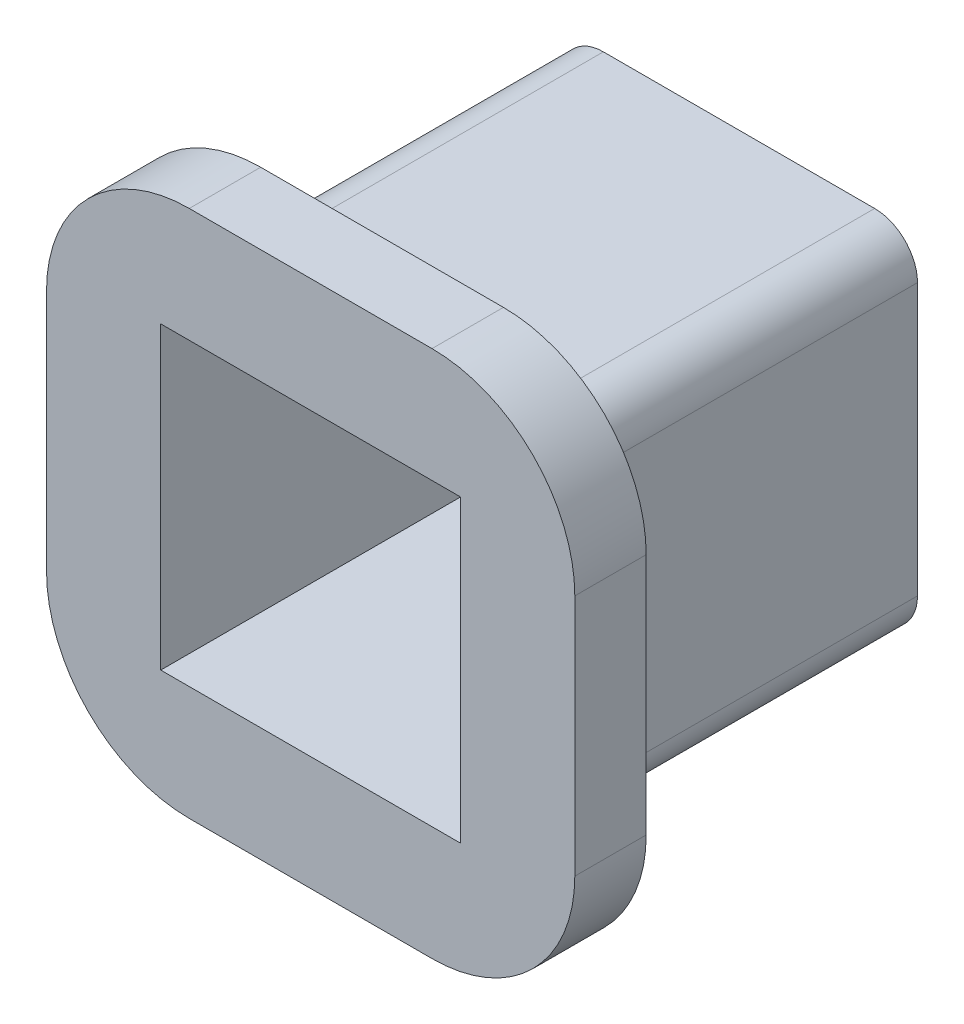
ISO-10303-21;
HEADER;
FILE_DESCRIPTION(('STEP AP214'),'2;1');
FILE_NAME('part.step','',(''),(''),'','','');
FILE_SCHEMA(('AUTOMOTIVE_DESIGN { 1 0 10303 214 1 1 1 1 }'));
ENDSEC;
DATA;
#1=APPLICATION_CONTEXT('core data for automotive mechanical design processes');
#2=APPLICATION_PROTOCOL_DEFINITION('international standard','automotive_design',2000,#1);
#3=PRODUCT_CONTEXT('',#1,'mechanical');
#4=PRODUCT('Part','Part','',(#3));
#5=PRODUCT_RELATED_PRODUCT_CATEGORY('part','',(#4));
#6=PRODUCT_DEFINITION_FORMATION('','',#4);
#7=PRODUCT_DEFINITION_CONTEXT('part definition',#1,'design');
#8=PRODUCT_DEFINITION('design','',#6,#7);
#9=PRODUCT_DEFINITION_SHAPE('','',#8);
#10=(LENGTH_UNIT() NAMED_UNIT(*) SI_UNIT(.MILLI.,.METRE.));
#11=(NAMED_UNIT(*) PLANE_ANGLE_UNIT() SI_UNIT($,.RADIAN.));
#12=(NAMED_UNIT(*) SI_UNIT($,.STERADIAN.) SOLID_ANGLE_UNIT());
#13=UNCERTAINTY_MEASURE_WITH_UNIT(LENGTH_MEASURE(1.E-05),#10,'distance_accuracy_value','');
#14=(GEOMETRIC_REPRESENTATION_CONTEXT(3) GLOBAL_UNCERTAINTY_ASSIGNED_CONTEXT((#13)) GLOBAL_UNIT_ASSIGNED_CONTEXT((#10,
#11,#12)) REPRESENTATION_CONTEXT('',''));
#15=CARTESIAN_POINT('',(0.,0.,0.));
#16=DIRECTION('',(0.,0.,1.));
#17=DIRECTION('',(1.,0.,0.));
#18=AXIS2_PLACEMENT_3D('',#15,#16,#17);
#19=CARTESIAN_POINT('',(12.5,12.5,30.));
#20=DIRECTION('',(-1.,0.,0.));
#21=DIRECTION('',(0.,-1.,0.));
#22=AXIS2_PLACEMENT_3D('',#19,#20,#21);
#23=PLANE('',#22);
#24=DIRECTION('',(0.,1.,0.));
#25=VECTOR('',#24,1.);
#26=CARTESIAN_POINT('',(12.5,-12.5,25.));
#27=LINE('',#26,#25);
#28=CARTESIAN_POINT('',(12.5,-9.5,25.));
#29=VERTEX_POINT('',#28);
#30=CARTESIAN_POINT('',(12.5,9.5,25.));
#31=VERTEX_POINT('',#30);
#32=EDGE_CURVE('E351',#29,#31,#27,.T.);
#33=ORIENTED_EDGE('',*,*,#32,.F.);
#34=DIRECTION('',(0.,0.,-1.));
#35=VECTOR('',#34,1.);
#36=CARTESIAN_POINT('',(12.5,-9.5,30.));
#37=LINE('',#36,#35);
#38=CARTESIAN_POINT('',(12.5,-9.5,0.));
#39=VERTEX_POINT('',#38);
#40=EDGE_CURVE('E330',#29,#39,#37,.T.);
#41=ORIENTED_EDGE('',*,*,#40,.T.);
#42=DIRECTION('',(0.,1.,0.));
#43=VECTOR('',#42,1.);
#44=CARTESIAN_POINT('',(12.5,12.5,0.));
#45=LINE('',#44,#43);
#46=CARTESIAN_POINT('',(12.5,9.5,0.));
#47=VERTEX_POINT('',#46);
#48=EDGE_CURVE('E198',#39,#47,#45,.T.);
#49=ORIENTED_EDGE('',*,*,#48,.T.);
#50=DIRECTION('',(0.,0.,-1.));
#51=VECTOR('',#50,1.);
#52=CARTESIAN_POINT('',(12.5,9.5,30.));
#53=LINE('',#52,#51);
#54=EDGE_CURVE('E327',#47,#31,#53,.F.);
#55=ORIENTED_EDGE('',*,*,#54,.T.);
#56=EDGE_LOOP('',(#33,#41,#49,#55));
#57=FACE_BOUND('',#56,.T.);
#58=ADVANCED_FACE('F39',(#57),#23,.F.);
#59=CARTESIAN_POINT('',(-12.5,12.5,30.));
#60=DIRECTION('',(0.,-1.,0.));
#61=DIRECTION('',(0.,0.,-1.));
#62=AXIS2_PLACEMENT_3D('',#59,#60,#61);
#63=PLANE('',#62);
#64=DIRECTION('',(-1.,0.,0.));
#65=VECTOR('',#64,1.);
#66=CARTESIAN_POINT('',(12.5,12.5,25.));
#67=LINE('',#66,#65);
#68=CARTESIAN_POINT('',(9.5,12.5,25.));
#69=VERTEX_POINT('',#68);
#70=CARTESIAN_POINT('',(-9.5,12.5,25.));
#71=VERTEX_POINT('',#70);
#72=EDGE_CURVE('E361',#69,#71,#67,.T.);
#73=ORIENTED_EDGE('',*,*,#72,.F.);
#74=DIRECTION('',(0.,0.,-1.));
#75=VECTOR('',#74,1.);
#76=CARTESIAN_POINT('',(9.5,12.5,30.));
#77=LINE('',#76,#75);
#78=CARTESIAN_POINT('',(9.5,12.5,0.));
#79=VERTEX_POINT('',#78);
#80=EDGE_CURVE('E336',#69,#79,#77,.T.);
#81=ORIENTED_EDGE('',*,*,#80,.T.);
#82=DIRECTION('',(-1.,0.,0.));
#83=VECTOR('',#82,1.);
#84=CARTESIAN_POINT('',(-12.5,12.5,0.));
#85=LINE('',#84,#83);
#86=CARTESIAN_POINT('',(-9.5,12.5,0.));
#87=VERTEX_POINT('',#86);
#88=EDGE_CURVE('E238',#79,#87,#85,.T.);
#89=ORIENTED_EDGE('',*,*,#88,.T.);
#90=DIRECTION('',(0.,0.,-1.));
#91=VECTOR('',#90,1.);
#92=CARTESIAN_POINT('',(-9.5,12.5,30.));
#93=LINE('',#92,#91);
#94=EDGE_CURVE('E55',#87,#71,#93,.F.);
#95=ORIENTED_EDGE('',*,*,#94,.T.);
#96=EDGE_LOOP('',(#73,#81,#89,#95));
#97=FACE_BOUND('',#96,.T.);
#98=ADVANCED_FACE('F385',(#97),#63,.F.);
#99=CARTESIAN_POINT('',(-12.5,12.5,30.));
#100=DIRECTION('',(1.,0.,0.));
#101=DIRECTION('',(0.,1.,0.));
#102=AXIS2_PLACEMENT_3D('',#99,#100,#101);
#103=PLANE('',#102);
#104=DIRECTION('',(0.,-1.,0.));
#105=VECTOR('',#104,1.);
#106=CARTESIAN_POINT('',(-12.5,12.5,0.));
#107=LINE('',#106,#105);
#108=CARTESIAN_POINT('',(-12.5,9.5,0.));
#109=VERTEX_POINT('',#108);
#110=CARTESIAN_POINT('',(-12.5,-9.5,0.));
#111=VERTEX_POINT('',#110);
#112=EDGE_CURVE('E241',#109,#111,#107,.T.);
#113=ORIENTED_EDGE('',*,*,#112,.T.);
#114=DIRECTION('',(0.,0.,-1.));
#115=VECTOR('',#114,1.);
#116=CARTESIAN_POINT('',(-12.5,-9.5,30.));
#117=LINE('',#116,#115);
#118=CARTESIAN_POINT('',(-12.5,-9.5,25.));
#119=VERTEX_POINT('',#118);
#120=EDGE_CURVE('E324',#111,#119,#117,.F.);
#121=ORIENTED_EDGE('',*,*,#120,.T.);
#122=DIRECTION('',(0.,-1.,0.));
#123=VECTOR('',#122,1.);
#124=CARTESIAN_POINT('',(-12.5,12.5,25.));
#125=LINE('',#124,#123);
#126=CARTESIAN_POINT('',(-12.5,9.5,25.));
#127=VERTEX_POINT('',#126);
#128=EDGE_CURVE('E381',#127,#119,#125,.T.);
#129=ORIENTED_EDGE('',*,*,#128,.F.);
#130=DIRECTION('',(0.,0.,-1.));
#131=VECTOR('',#130,1.);
#132=CARTESIAN_POINT('',(-12.5,9.5,30.));
#133=LINE('',#132,#131);
#134=EDGE_CURVE('E320',#127,#109,#133,.T.);
#135=ORIENTED_EDGE('',*,*,#134,.T.);
#136=EDGE_LOOP('',(#113,#121,#129,#135));
#137=FACE_BOUND('',#136,.T.);
#138=ADVANCED_FACE('F377',(#137),#103,.F.);
#139=CARTESIAN_POINT('',(-12.5,-12.5,30.));
#140=DIRECTION('',(0.,1.,0.));
#141=DIRECTION('',(0.,0.,1.));
#142=AXIS2_PLACEMENT_3D('',#139,#140,#141);
#143=PLANE('',#142);
#144=DIRECTION('',(1.,0.,0.));
#145=VECTOR('',#144,1.);
#146=CARTESIAN_POINT('',(-12.5,-12.5,25.));
#147=LINE('',#146,#145);
#148=CARTESIAN_POINT('',(-9.5,-12.5,25.));
#149=VERTEX_POINT('',#148);
#150=CARTESIAN_POINT('',(9.5,-12.5,25.));
#151=VERTEX_POINT('',#150);
#152=EDGE_CURVE('E353',#149,#151,#147,.T.);
#153=ORIENTED_EDGE('',*,*,#152,.F.);
#154=DIRECTION('',(0.,0.,-1.));
#155=VECTOR('',#154,1.);
#156=CARTESIAN_POINT('',(-9.5,-12.5,30.));
#157=LINE('',#156,#155);
#158=CARTESIAN_POINT('',(-9.5,-12.5,0.));
#159=VERTEX_POINT('',#158);
#160=EDGE_CURVE('E304',#149,#159,#157,.T.);
#161=ORIENTED_EDGE('',*,*,#160,.T.);
#162=DIRECTION('',(1.,0.,0.));
#163=VECTOR('',#162,1.);
#164=CARTESIAN_POINT('',(-12.5,-12.5,0.));
#165=LINE('',#164,#163);
#166=CARTESIAN_POINT('',(9.5,-12.5,0.));
#167=VERTEX_POINT('',#166);
#168=EDGE_CURVE('E245',#159,#167,#165,.T.);
#169=ORIENTED_EDGE('',*,*,#168,.T.);
#170=DIRECTION('',(0.,0.,-1.));
#171=VECTOR('',#170,1.);
#172=CARTESIAN_POINT('',(9.5,-12.5,30.));
#173=LINE('',#172,#171);
#174=EDGE_CURVE('E301',#167,#151,#173,.F.);
#175=ORIENTED_EDGE('',*,*,#174,.T.);
#176=EDGE_LOOP('',(#153,#161,#169,#175));
#177=FACE_BOUND('',#176,.T.);
#178=ADVANCED_FACE('F369',(#177),#143,.F.);
#179=CARTESIAN_POINT('',(0.,0.,30.));
#180=DIRECTION('',(0.,0.,1.));
#181=DIRECTION('',(1.,0.,0.));
#182=AXIS2_PLACEMENT_3D('',#179,#180,#181);
#183=PLANE('',#182);
#184=DIRECTION('',(0.,-1.,0.));
#185=VECTOR('',#184,1.);
#186=CARTESIAN_POINT('',(-10.5,10.5,30.));
#187=LINE('',#186,#185);
#188=CARTESIAN_POINT('',(-10.5,10.5,30.));
#189=VERTEX_POINT('',#188);
#190=CARTESIAN_POINT('',(-10.5,-10.5,30.));
#191=VERTEX_POINT('',#190);
#192=EDGE_CURVE('E189',#189,#191,#187,.T.);
#193=ORIENTED_EDGE('',*,*,#192,.F.);
#194=DIRECTION('',(-1.,0.,0.));
#195=VECTOR('',#194,1.);
#196=CARTESIAN_POINT('',(-10.5,10.5,30.));
#197=LINE('',#196,#195);
#198=CARTESIAN_POINT('',(10.5,10.5,30.));
#199=VERTEX_POINT('',#198);
#200=EDGE_CURVE('E178',#199,#189,#197,.T.);
#201=ORIENTED_EDGE('',*,*,#200,.F.);
#202=DIRECTION('',(0.,1.,0.));
#203=VECTOR('',#202,1.);
#204=CARTESIAN_POINT('',(10.5,10.5,30.));
#205=LINE('',#204,#203);
#206=CARTESIAN_POINT('',(10.5,-10.5,30.));
#207=VERTEX_POINT('',#206);
#208=EDGE_CURVE('E209',#207,#199,#205,.T.);
#209=ORIENTED_EDGE('',*,*,#208,.F.);
#210=DIRECTION('',(1.,0.,0.));
#211=VECTOR('',#210,1.);
#212=CARTESIAN_POINT('',(-10.5,-10.5,30.));
#213=LINE('',#212,#211);
#214=EDGE_CURVE('E205',#191,#207,#213,.T.);
#215=ORIENTED_EDGE('',*,*,#214,.F.);
#216=EDGE_LOOP('',(#193,#201,#209,#215));
#217=FACE_BOUND('',#216,.T.);
#218=DIRECTION('',(1.,0.,0.));
#219=VECTOR('',#218,1.);
#220=CARTESIAN_POINT('',(-18.5,-18.5,30.));
#221=LINE('',#220,#219);
#222=CARTESIAN_POINT('',(-8.5,-18.5,30.));
#223=VERTEX_POINT('',#222);
#224=CARTESIAN_POINT('',(8.5,-18.5,30.));
#225=VERTEX_POINT('',#224);
#226=EDGE_CURVE('E613',#223,#225,#221,.T.);
#227=ORIENTED_EDGE('',*,*,#226,.T.);
#228=CARTESIAN_POINT('',(8.5,-8.5,30.));
#229=DIRECTION('',(0.,0.,1.));
#230=DIRECTION('',(1.,0.,0.));
#231=AXIS2_PLACEMENT_3D('',#228,#229,#230);
#232=CIRCLE('',#231,10.);
#233=CARTESIAN_POINT('',(18.5,-8.5,30.));
#234=VERTEX_POINT('',#233);
#235=EDGE_CURVE('E265',#225,#234,#232,.T.);
#236=ORIENTED_EDGE('',*,*,#235,.T.);
#237=DIRECTION('',(0.,1.,0.));
#238=VECTOR('',#237,1.);
#239=CARTESIAN_POINT('',(18.5,-18.5,30.));
#240=LINE('',#239,#238);
#241=CARTESIAN_POINT('',(18.5,8.5,30.));
#242=VERTEX_POINT('',#241);
#243=EDGE_CURVE('E612',#234,#242,#240,.T.);
#244=ORIENTED_EDGE('',*,*,#243,.T.);
#245=CARTESIAN_POINT('',(8.5,8.5,30.));
#246=DIRECTION('',(0.,0.,1.));
#247=DIRECTION('',(1.,0.,0.));
#248=AXIS2_PLACEMENT_3D('',#245,#246,#247);
#249=CIRCLE('',#248,10.);
#250=CARTESIAN_POINT('',(8.5,18.5,30.));
#251=VERTEX_POINT('',#250);
#252=EDGE_CURVE('E259',#242,#251,#249,.T.);
#253=ORIENTED_EDGE('',*,*,#252,.T.);
#254=DIRECTION('',(-1.,0.,0.));
#255=VECTOR('',#254,1.);
#256=CARTESIAN_POINT('',(18.5,18.5,30.));
#257=LINE('',#256,#255);
#258=CARTESIAN_POINT('',(-8.5,18.5,30.));
#259=VERTEX_POINT('',#258);
#260=EDGE_CURVE('E618',#251,#259,#257,.T.);
#261=ORIENTED_EDGE('',*,*,#260,.T.);
#262=CARTESIAN_POINT('',(-8.5,8.5,30.));
#263=DIRECTION('',(0.,0.,1.));
#264=DIRECTION('',(1.,0.,0.));
#265=AXIS2_PLACEMENT_3D('',#262,#263,#264);
#266=CIRCLE('',#265,10.);
#267=CARTESIAN_POINT('',(-18.5,8.5,30.));
#268=VERTEX_POINT('',#267);
#269=EDGE_CURVE('E256',#259,#268,#266,.T.);
#270=ORIENTED_EDGE('',*,*,#269,.T.);
#271=DIRECTION('',(0.,-1.,0.));
#272=VECTOR('',#271,1.);
#273=CARTESIAN_POINT('',(-18.5,18.5,30.));
#274=LINE('',#273,#272);
#275=CARTESIAN_POINT('',(-18.5,-8.5,30.));
#276=VERTEX_POINT('',#275);
#277=EDGE_CURVE('E606',#268,#276,#274,.T.);
#278=ORIENTED_EDGE('',*,*,#277,.T.);
#279=CARTESIAN_POINT('',(-8.5,-8.5,30.));
#280=DIRECTION('',(0.,0.,1.));
#281=DIRECTION('',(1.,0.,0.));
#282=AXIS2_PLACEMENT_3D('',#279,#280,#281);
#283=CIRCLE('',#282,10.);
#284=EDGE_CURVE('E262',#276,#223,#283,.T.);
#285=ORIENTED_EDGE('',*,*,#284,.T.);
#286=EDGE_LOOP('',(#227,#236,#244,#253,#261,#270,#278,#285));
#287=FACE_BOUND('',#286,.T.);
#288=ADVANCED_FACE('F202',(#217,#287),#183,.T.);
#289=CARTESIAN_POINT('',(0.,0.,0.));
#290=DIRECTION('',(0.,0.,1.));
#291=DIRECTION('',(1.,0.,0.));
#292=AXIS2_PLACEMENT_3D('',#289,#290,#291);
#293=PLANE('',#292);
#294=ORIENTED_EDGE('',*,*,#168,.F.);
#295=CARTESIAN_POINT('',(-9.5,-9.5,0.));
#296=DIRECTION('',(0.,0.,1.));
#297=DIRECTION('',(1.,0.,0.));
#298=AXIS2_PLACEMENT_3D('',#295,#296,#297);
#299=CIRCLE('',#298,3.);
#300=EDGE_CURVE('E317',#159,#111,#299,.F.);
#301=ORIENTED_EDGE('',*,*,#300,.T.);
#302=ORIENTED_EDGE('',*,*,#112,.F.);
#303=CARTESIAN_POINT('',(-9.5,9.5,0.));
#304=DIRECTION('',(0.,0.,1.));
#305=DIRECTION('',(1.,0.,0.));
#306=AXIS2_PLACEMENT_3D('',#303,#304,#305);
#307=CIRCLE('',#306,3.);
#308=EDGE_CURVE('E308',#109,#87,#307,.F.);
#309=ORIENTED_EDGE('',*,*,#308,.T.);
#310=ORIENTED_EDGE('',*,*,#88,.F.);
#311=CARTESIAN_POINT('',(9.5,9.5,0.));
#312=DIRECTION('',(0.,0.,1.));
#313=DIRECTION('',(1.,0.,0.));
#314=AXIS2_PLACEMENT_3D('',#311,#312,#313);
#315=CIRCLE('',#314,3.);
#316=EDGE_CURVE('E311',#79,#47,#315,.F.);
#317=ORIENTED_EDGE('',*,*,#316,.T.);
#318=ORIENTED_EDGE('',*,*,#48,.F.);
#319=CARTESIAN_POINT('',(9.5,-9.5,0.));
#320=DIRECTION('',(0.,0.,1.));
#321=DIRECTION('',(1.,0.,0.));
#322=AXIS2_PLACEMENT_3D('',#319,#320,#321);
#323=CIRCLE('',#322,3.);
#324=EDGE_CURVE('E314',#39,#167,#323,.F.);
#325=ORIENTED_EDGE('',*,*,#324,.T.);
#326=EDGE_LOOP('',(#294,#301,#302,#309,#310,#317,#318,#325));
#327=FACE_BOUND('',#326,.T.);
#328=DIRECTION('',(-1.,0.,0.));
#329=VECTOR('',#328,1.);
#330=CARTESIAN_POINT('',(-10.5,10.5,0.));
#331=LINE('',#330,#329);
#332=CARTESIAN_POINT('',(10.5,10.5,0.));
#333=VERTEX_POINT('',#332);
#334=CARTESIAN_POINT('',(-10.5,10.5,0.));
#335=VERTEX_POINT('',#334);
#336=EDGE_CURVE('E215',#333,#335,#331,.T.);
#337=ORIENTED_EDGE('',*,*,#336,.T.);
#338=DIRECTION('',(0.,-1.,0.));
#339=VECTOR('',#338,1.);
#340=CARTESIAN_POINT('',(-10.5,10.5,0.));
#341=LINE('',#340,#339);
#342=CARTESIAN_POINT('',(-10.5,-10.5,0.));
#343=VERTEX_POINT('',#342);
#344=EDGE_CURVE('E196',#335,#343,#341,.T.);
#345=ORIENTED_EDGE('',*,*,#344,.T.);
#346=DIRECTION('',(1.,0.,0.));
#347=VECTOR('',#346,1.);
#348=CARTESIAN_POINT('',(-10.5,-10.5,0.));
#349=LINE('',#348,#347);
#350=CARTESIAN_POINT('',(10.5,-10.5,0.));
#351=VERTEX_POINT('',#350);
#352=EDGE_CURVE('E221',#343,#351,#349,.T.);
#353=ORIENTED_EDGE('',*,*,#352,.T.);
#354=DIRECTION('',(0.,1.,0.));
#355=VECTOR('',#354,1.);
#356=CARTESIAN_POINT('',(10.5,10.5,0.));
#357=LINE('',#356,#355);
#358=EDGE_CURVE('E190',#351,#333,#357,.T.);
#359=ORIENTED_EDGE('',*,*,#358,.T.);
#360=EDGE_LOOP('',(#337,#345,#353,#359));
#361=FACE_BOUND('',#360,.T.);
#362=ADVANCED_FACE('F366',(#327,#361),#293,.F.);
#363=CARTESIAN_POINT('',(-10.5,10.5,30.));
#364=DIRECTION('',(0.,-1.,0.));
#365=DIRECTION('',(0.,0.,-1.));
#366=AXIS2_PLACEMENT_3D('',#363,#364,#365);
#367=PLANE('',#366);
#368=ORIENTED_EDGE('',*,*,#336,.F.);
#369=DIRECTION('',(0.,0.,-1.));
#370=VECTOR('',#369,1.);
#371=CARTESIAN_POINT('',(10.5,10.5,30.));
#372=LINE('',#371,#370);
#373=EDGE_CURVE('E184',#199,#333,#372,.T.);
#374=ORIENTED_EDGE('',*,*,#373,.F.);
#375=ORIENTED_EDGE('',*,*,#200,.T.);
#376=DIRECTION('',(0.,0.,-1.));
#377=VECTOR('',#376,1.);
#378=CARTESIAN_POINT('',(-10.5,10.5,30.));
#379=LINE('',#378,#377);
#380=EDGE_CURVE('E181',#189,#335,#379,.T.);
#381=ORIENTED_EDGE('',*,*,#380,.T.);
#382=EDGE_LOOP('',(#368,#374,#375,#381));
#383=FACE_BOUND('',#382,.T.);
#384=ADVANCED_FACE('F180',(#383),#367,.T.);
#385=CARTESIAN_POINT('',(-10.5,10.5,30.));
#386=DIRECTION('',(1.,0.,0.));
#387=DIRECTION('',(0.,0.,-1.));
#388=AXIS2_PLACEMENT_3D('',#385,#386,#387);
#389=PLANE('',#388);
#390=ORIENTED_EDGE('',*,*,#344,.F.);
#391=ORIENTED_EDGE('',*,*,#380,.F.);
#392=ORIENTED_EDGE('',*,*,#192,.T.);
#393=DIRECTION('',(0.,0.,-1.));
#394=VECTOR('',#393,1.);
#395=CARTESIAN_POINT('',(-10.5,-10.5,30.));
#396=LINE('',#395,#394);
#397=EDGE_CURVE('E199',#191,#343,#396,.T.);
#398=ORIENTED_EDGE('',*,*,#397,.T.);
#399=EDGE_LOOP('',(#390,#391,#392,#398));
#400=FACE_BOUND('',#399,.T.);
#401=ADVANCED_FACE('F193',(#400),#389,.T.);
#402=CARTESIAN_POINT('',(-10.5,-10.5,30.));
#403=DIRECTION('',(0.,1.,0.));
#404=DIRECTION('',(-1.,0.,0.));
#405=AXIS2_PLACEMENT_3D('',#402,#403,#404);
#406=PLANE('',#405);
#407=ORIENTED_EDGE('',*,*,#352,.F.);
#408=ORIENTED_EDGE('',*,*,#397,.F.);
#409=ORIENTED_EDGE('',*,*,#214,.T.);
#410=DIRECTION('',(0.,0.,-1.));
#411=VECTOR('',#410,1.);
#412=CARTESIAN_POINT('',(10.5,-10.5,30.));
#413=LINE('',#412,#411);
#414=EDGE_CURVE('E230',#207,#351,#413,.T.);
#415=ORIENTED_EDGE('',*,*,#414,.T.);
#416=EDGE_LOOP('',(#407,#408,#409,#415));
#417=FACE_BOUND('',#416,.T.);
#418=ADVANCED_FACE('F547',(#417),#406,.T.);
#419=CARTESIAN_POINT('',(10.5,10.5,30.));
#420=DIRECTION('',(-1.,0.,0.));
#421=DIRECTION('',(0.,-1.,0.));
#422=AXIS2_PLACEMENT_3D('',#419,#420,#421);
#423=PLANE('',#422);
#424=ORIENTED_EDGE('',*,*,#358,.F.);
#425=ORIENTED_EDGE('',*,*,#414,.F.);
#426=ORIENTED_EDGE('',*,*,#208,.T.);
#427=ORIENTED_EDGE('',*,*,#373,.T.);
#428=EDGE_LOOP('',(#424,#425,#426,#427));
#429=FACE_BOUND('',#428,.T.);
#430=ADVANCED_FACE('F505',(#429),#423,.T.);
#431=CARTESIAN_POINT('',(-18.5,-18.5,25.));
#432=DIRECTION('',(0.,-1.,0.));
#433=DIRECTION('',(0.,0.,-1.));
#434=AXIS2_PLACEMENT_3D('',#431,#432,#433);
#435=PLANE('',#434);
#436=DIRECTION('',(1.,0.,0.));
#437=VECTOR('',#436,1.);
#438=CARTESIAN_POINT('',(-18.5,-18.5,25.));
#439=LINE('',#438,#437);
#440=CARTESIAN_POINT('',(-8.5,-18.5,25.));
#441=VERTEX_POINT('',#440);
#442=CARTESIAN_POINT('',(8.5,-18.5,25.));
#443=VERTEX_POINT('',#442);
#444=EDGE_CURVE('E598',#441,#443,#439,.T.);
#445=ORIENTED_EDGE('',*,*,#444,.T.);
#446=DIRECTION('',(0.,0.,1.));
#447=VECTOR('',#446,1.);
#448=CARTESIAN_POINT('',(8.5,-18.5,25.));
#449=LINE('',#448,#447);
#450=EDGE_CURVE('E252',#443,#225,#449,.T.);
#451=ORIENTED_EDGE('',*,*,#450,.T.);
#452=ORIENTED_EDGE('',*,*,#226,.F.);
#453=DIRECTION('',(0.,0.,1.));
#454=VECTOR('',#453,1.);
#455=CARTESIAN_POINT('',(-8.5,-18.5,25.));
#456=LINE('',#455,#454);
#457=EDGE_CURVE('E249',#223,#441,#456,.F.);
#458=ORIENTED_EDGE('',*,*,#457,.T.);
#459=EDGE_LOOP('',(#445,#451,#452,#458));
#460=FACE_BOUND('',#459,.T.);
#461=ADVANCED_FACE('F496',(#460),#435,.T.);
#462=CARTESIAN_POINT('',(-18.5,18.5,25.));
#463=DIRECTION('',(-1.,0.,0.));
#464=DIRECTION('',(0.,0.,1.));
#465=AXIS2_PLACEMENT_3D('',#462,#463,#464);
#466=PLANE('',#465);
#467=DIRECTION('',(0.,-1.,0.));
#468=VECTOR('',#467,1.);
#469=CARTESIAN_POINT('',(-18.5,18.5,25.));
#470=LINE('',#469,#468);
#471=CARTESIAN_POINT('',(-18.5,8.5,25.));
#472=VERTEX_POINT('',#471);
#473=CARTESIAN_POINT('',(-18.5,-8.5,25.));
#474=VERTEX_POINT('',#473);
#475=EDGE_CURVE('E218',#472,#474,#470,.T.);
#476=ORIENTED_EDGE('',*,*,#475,.T.);
#477=DIRECTION('',(0.,0.,1.));
#478=VECTOR('',#477,1.);
#479=CARTESIAN_POINT('',(-18.5,-8.5,25.));
#480=LINE('',#479,#478);
#481=EDGE_CURVE('E290',#474,#276,#480,.T.);
#482=ORIENTED_EDGE('',*,*,#481,.T.);
#483=ORIENTED_EDGE('',*,*,#277,.F.);
#484=DIRECTION('',(0.,0.,1.));
#485=VECTOR('',#484,1.);
#486=CARTESIAN_POINT('',(-18.5,8.5,25.));
#487=LINE('',#486,#485);
#488=EDGE_CURVE('E287',#268,#472,#487,.F.);
#489=ORIENTED_EDGE('',*,*,#488,.T.);
#490=EDGE_LOOP('',(#476,#482,#483,#489));
#491=FACE_BOUND('',#490,.T.);
#492=ADVANCED_FACE('F487',(#491),#466,.T.);
#493=CARTESIAN_POINT('',(18.5,18.5,25.));
#494=DIRECTION('',(0.,1.,0.));
#495=DIRECTION('',(0.,0.,1.));
#496=AXIS2_PLACEMENT_3D('',#493,#494,#495);
#497=PLANE('',#496);
#498=ORIENTED_EDGE('',*,*,#260,.F.);
#499=DIRECTION('',(0.,0.,1.));
#500=VECTOR('',#499,1.);
#501=CARTESIAN_POINT('',(8.5,18.5,25.));
#502=LINE('',#501,#500);
#503=CARTESIAN_POINT('',(8.5,18.5,25.));
#504=VERTEX_POINT('',#503);
#505=EDGE_CURVE('E298',#251,#504,#502,.F.);
#506=ORIENTED_EDGE('',*,*,#505,.T.);
#507=DIRECTION('',(-1.,0.,0.));
#508=VECTOR('',#507,1.);
#509=CARTESIAN_POINT('',(18.5,18.5,25.));
#510=LINE('',#509,#508);
#511=CARTESIAN_POINT('',(-8.5,18.5,25.));
#512=VERTEX_POINT('',#511);
#513=EDGE_CURVE('E637',#504,#512,#510,.T.);
#514=ORIENTED_EDGE('',*,*,#513,.T.);
#515=DIRECTION('',(0.,0.,1.));
#516=VECTOR('',#515,1.);
#517=CARTESIAN_POINT('',(-8.5,18.5,25.));
#518=LINE('',#517,#516);
#519=EDGE_CURVE('E294',#512,#259,#518,.T.);
#520=ORIENTED_EDGE('',*,*,#519,.T.);
#521=EDGE_LOOP('',(#498,#506,#514,#520));
#522=FACE_BOUND('',#521,.T.);
#523=ADVANCED_FACE('F478',(#522),#497,.T.);
#524=CARTESIAN_POINT('',(18.5,-18.5,25.));
#525=DIRECTION('',(1.,0.,0.));
#526=DIRECTION('',(0.,0.,-1.));
#527=AXIS2_PLACEMENT_3D('',#524,#525,#526);
#528=PLANE('',#527);
#529=ORIENTED_EDGE('',*,*,#243,.F.);
#530=DIRECTION('',(0.,0.,1.));
#531=VECTOR('',#530,1.);
#532=CARTESIAN_POINT('',(18.5,-8.5,25.));
#533=LINE('',#532,#531);
#534=CARTESIAN_POINT('',(18.5,-8.5,25.));
#535=VERTEX_POINT('',#534);
#536=EDGE_CURVE('E272',#234,#535,#533,.F.);
#537=ORIENTED_EDGE('',*,*,#536,.T.);
#538=DIRECTION('',(0.,1.,0.));
#539=VECTOR('',#538,1.);
#540=CARTESIAN_POINT('',(18.5,-18.5,25.));
#541=LINE('',#540,#539);
#542=CARTESIAN_POINT('',(18.5,8.5,25.));
#543=VERTEX_POINT('',#542);
#544=EDGE_CURVE('E605',#535,#543,#541,.T.);
#545=ORIENTED_EDGE('',*,*,#544,.T.);
#546=DIRECTION('',(0.,0.,1.));
#547=VECTOR('',#546,1.);
#548=CARTESIAN_POINT('',(18.5,8.5,25.));
#549=LINE('',#548,#547);
#550=EDGE_CURVE('E268',#543,#242,#549,.T.);
#551=ORIENTED_EDGE('',*,*,#550,.T.);
#552=EDGE_LOOP('',(#529,#537,#545,#551));
#553=FACE_BOUND('',#552,.T.);
#554=ADVANCED_FACE('F470',(#553),#528,.T.);
#555=CARTESIAN_POINT('',(0.,0.,25.));
#556=DIRECTION('',(0.,0.,1.));
#557=DIRECTION('',(1.,0.,0.));
#558=AXIS2_PLACEMENT_3D('',#555,#556,#557);
#559=PLANE('',#558);
#560=ORIENTED_EDGE('',*,*,#72,.T.);
#561=CARTESIAN_POINT('',(-9.5,9.5,25.));
#562=DIRECTION('',(0.,0.,1.));
#563=DIRECTION('',(1.,0.,0.));
#564=AXIS2_PLACEMENT_3D('',#561,#562,#563);
#565=CIRCLE('',#564,3.);
#566=EDGE_CURVE('E11',#71,#127,#565,.T.);
#567=ORIENTED_EDGE('',*,*,#566,.T.);
#568=ORIENTED_EDGE('',*,*,#128,.T.);
#569=CARTESIAN_POINT('',(-9.5,-9.5,25.));
#570=DIRECTION('',(0.,0.,1.));
#571=DIRECTION('',(1.,0.,0.));
#572=AXIS2_PLACEMENT_3D('',#569,#570,#571);
#573=CIRCLE('',#572,3.);
#574=EDGE_CURVE('E340',#119,#149,#573,.T.);
#575=ORIENTED_EDGE('',*,*,#574,.T.);
#576=ORIENTED_EDGE('',*,*,#152,.T.);
#577=CARTESIAN_POINT('',(9.5,-9.5,25.));
#578=DIRECTION('',(0.,0.,1.));
#579=DIRECTION('',(1.,0.,0.));
#580=AXIS2_PLACEMENT_3D('',#577,#578,#579);
#581=CIRCLE('',#580,3.);
#582=EDGE_CURVE('E343',#151,#29,#581,.T.);
#583=ORIENTED_EDGE('',*,*,#582,.T.);
#584=ORIENTED_EDGE('',*,*,#32,.T.);
#585=CARTESIAN_POINT('',(9.5,9.5,25.));
#586=DIRECTION('',(0.,0.,1.));
#587=DIRECTION('',(1.,0.,0.));
#588=AXIS2_PLACEMENT_3D('',#585,#586,#587);
#589=CIRCLE('',#588,3.);
#590=EDGE_CURVE('E48',#31,#69,#589,.T.);
#591=ORIENTED_EDGE('',*,*,#590,.T.);
#592=EDGE_LOOP('',(#560,#567,#568,#575,#576,#583,#584,#591));
#593=FACE_BOUND('',#592,.T.);
#594=ORIENTED_EDGE('',*,*,#544,.F.);
#595=CARTESIAN_POINT('',(8.5,-8.5,25.));
#596=DIRECTION('',(0.,0.,1.));
#597=DIRECTION('',(1.,0.,0.));
#598=AXIS2_PLACEMENT_3D('',#595,#596,#597);
#599=CIRCLE('',#598,10.);
#600=EDGE_CURVE('E284',#535,#443,#599,.F.);
#601=ORIENTED_EDGE('',*,*,#600,.T.);
#602=ORIENTED_EDGE('',*,*,#444,.F.);
#603=CARTESIAN_POINT('',(-8.5,-8.5,25.));
#604=DIRECTION('',(0.,0.,1.));
#605=DIRECTION('',(1.,0.,0.));
#606=AXIS2_PLACEMENT_3D('',#603,#604,#605);
#607=CIRCLE('',#606,10.);
#608=EDGE_CURVE('E281',#441,#474,#607,.F.);
#609=ORIENTED_EDGE('',*,*,#608,.T.);
#610=ORIENTED_EDGE('',*,*,#475,.F.);
#611=CARTESIAN_POINT('',(-8.5,8.5,25.));
#612=DIRECTION('',(0.,0.,1.));
#613=DIRECTION('',(1.,0.,0.));
#614=AXIS2_PLACEMENT_3D('',#611,#612,#613);
#615=CIRCLE('',#614,10.);
#616=EDGE_CURVE('E275',#472,#512,#615,.F.);
#617=ORIENTED_EDGE('',*,*,#616,.T.);
#618=ORIENTED_EDGE('',*,*,#513,.F.);
#619=CARTESIAN_POINT('',(8.5,8.5,25.));
#620=DIRECTION('',(0.,0.,1.));
#621=DIRECTION('',(1.,0.,0.));
#622=AXIS2_PLACEMENT_3D('',#619,#620,#621);
#623=CIRCLE('',#622,10.);
#624=EDGE_CURVE('E278',#504,#543,#623,.F.);
#625=ORIENTED_EDGE('',*,*,#624,.T.);
#626=EDGE_LOOP('',(#594,#601,#602,#609,#610,#617,#618,#625));
#627=FACE_BOUND('',#626,.T.);
#628=ADVANCED_FACE('F349',(#593,#627),#559,.F.);
#629=CARTESIAN_POINT('',(8.5,-8.5,25.));
#630=DIRECTION('',(0.,0.,1.));
#631=DIRECTION('',(1.,0.,0.));
#632=AXIS2_PLACEMENT_3D('',#629,#630,#631);
#633=CYLINDRICAL_SURFACE('',#632,10.);
#634=ORIENTED_EDGE('',*,*,#600,.F.);
#635=ORIENTED_EDGE('',*,*,#536,.F.);
#636=ORIENTED_EDGE('',*,*,#235,.F.);
#637=ORIENTED_EDGE('',*,*,#450,.F.);
#638=EDGE_LOOP('',(#634,#635,#636,#637));
#639=FACE_BOUND('',#638,.T.);
#640=ADVANCED_FACE('F403',(#639),#633,.T.);
#641=CARTESIAN_POINT('',(-8.5,-8.5,25.));
#642=DIRECTION('',(0.,0.,1.));
#643=DIRECTION('',(1.,0.,0.));
#644=AXIS2_PLACEMENT_3D('',#641,#642,#643);
#645=CYLINDRICAL_SURFACE('',#644,10.);
#646=ORIENTED_EDGE('',*,*,#608,.F.);
#647=ORIENTED_EDGE('',*,*,#457,.F.);
#648=ORIENTED_EDGE('',*,*,#284,.F.);
#649=ORIENTED_EDGE('',*,*,#481,.F.);
#650=EDGE_LOOP('',(#646,#647,#648,#649));
#651=FACE_BOUND('',#650,.T.);
#652=ADVANCED_FACE('F406',(#651),#645,.T.);
#653=CARTESIAN_POINT('',(8.5,8.5,25.));
#654=DIRECTION('',(0.,0.,1.));
#655=DIRECTION('',(1.,0.,0.));
#656=AXIS2_PLACEMENT_3D('',#653,#654,#655);
#657=CYLINDRICAL_SURFACE('',#656,10.);
#658=ORIENTED_EDGE('',*,*,#624,.F.);
#659=ORIENTED_EDGE('',*,*,#505,.F.);
#660=ORIENTED_EDGE('',*,*,#252,.F.);
#661=ORIENTED_EDGE('',*,*,#550,.F.);
#662=EDGE_LOOP('',(#658,#659,#660,#661));
#663=FACE_BOUND('',#662,.T.);
#664=ADVANCED_FACE('F410',(#663),#657,.T.);
#665=CARTESIAN_POINT('',(-8.5,8.5,25.));
#666=DIRECTION('',(0.,0.,1.));
#667=DIRECTION('',(1.,0.,0.));
#668=AXIS2_PLACEMENT_3D('',#665,#666,#667);
#669=CYLINDRICAL_SURFACE('',#668,10.);
#670=ORIENTED_EDGE('',*,*,#616,.F.);
#671=ORIENTED_EDGE('',*,*,#488,.F.);
#672=ORIENTED_EDGE('',*,*,#269,.F.);
#673=ORIENTED_EDGE('',*,*,#519,.F.);
#674=EDGE_LOOP('',(#670,#671,#672,#673));
#675=FACE_BOUND('',#674,.T.);
#676=ADVANCED_FACE('F414',(#675),#669,.T.);
#677=CARTESIAN_POINT('',(-9.5,-9.5,30.));
#678=DIRECTION('',(0.,0.,-1.));
#679=DIRECTION('',(-1.,0.,0.));
#680=AXIS2_PLACEMENT_3D('',#677,#678,#679);
#681=CYLINDRICAL_SURFACE('',#680,3.);
#682=ORIENTED_EDGE('',*,*,#574,.F.);
#683=ORIENTED_EDGE('',*,*,#120,.F.);
#684=ORIENTED_EDGE('',*,*,#300,.F.);
#685=ORIENTED_EDGE('',*,*,#160,.F.);
#686=EDGE_LOOP('',(#682,#683,#684,#685));
#687=FACE_BOUND('',#686,.T.);
#688=ADVANCED_FACE('F373',(#687),#681,.T.);
#689=CARTESIAN_POINT('',(9.5,-9.5,30.));
#690=DIRECTION('',(0.,0.,-1.));
#691=DIRECTION('',(-1.,0.,0.));
#692=AXIS2_PLACEMENT_3D('',#689,#690,#691);
#693=CYLINDRICAL_SURFACE('',#692,3.);
#694=ORIENTED_EDGE('',*,*,#582,.F.);
#695=ORIENTED_EDGE('',*,*,#174,.F.);
#696=ORIENTED_EDGE('',*,*,#324,.F.);
#697=ORIENTED_EDGE('',*,*,#40,.F.);
#698=EDGE_LOOP('',(#694,#695,#696,#697));
#699=FACE_BOUND('',#698,.T.);
#700=ADVANCED_FACE('F363',(#699),#693,.T.);
#701=CARTESIAN_POINT('',(9.5,9.5,30.));
#702=DIRECTION('',(0.,0.,-1.));
#703=DIRECTION('',(-1.,0.,0.));
#704=AXIS2_PLACEMENT_3D('',#701,#702,#703);
#705=CYLINDRICAL_SURFACE('',#704,3.);
#706=ORIENTED_EDGE('',*,*,#590,.F.);
#707=ORIENTED_EDGE('',*,*,#54,.F.);
#708=ORIENTED_EDGE('',*,*,#316,.F.);
#709=ORIENTED_EDGE('',*,*,#80,.F.);
#710=EDGE_LOOP('',(#706,#707,#708,#709));
#711=FACE_BOUND('',#710,.T.);
#712=ADVANCED_FACE('F388',(#711),#705,.T.);
#713=CARTESIAN_POINT('',(-9.5,9.5,30.));
#714=DIRECTION('',(0.,0.,-1.));
#715=DIRECTION('',(-1.,0.,0.));
#716=AXIS2_PLACEMENT_3D('',#713,#714,#715);
#717=CYLINDRICAL_SURFACE('',#716,3.);
#718=ORIENTED_EDGE('',*,*,#566,.F.);
#719=ORIENTED_EDGE('',*,*,#94,.F.);
#720=ORIENTED_EDGE('',*,*,#308,.F.);
#721=ORIENTED_EDGE('',*,*,#134,.F.);
#722=EDGE_LOOP('',(#718,#719,#720,#721));
#723=FACE_BOUND('',#722,.T.);
#724=ADVANCED_FACE('F41',(#723),#717,.T.);
#725=CLOSED_SHELL('',(#58,#98,#138,#178,#288,#362,#384,#401,#418,#430,#461,#492,#523,#554,#628,
#640,#652,#664,#676,#688,#700,#712,#724));
#726=MANIFOLD_SOLID_BREP('B2',#725);
#727=ADVANCED_BREP_SHAPE_REPRESENTATION('',(#18,#726),#14);
#728=SHAPE_DEFINITION_REPRESENTATION(#9,#727);
ENDSEC;
END-ISO-10303-21;
